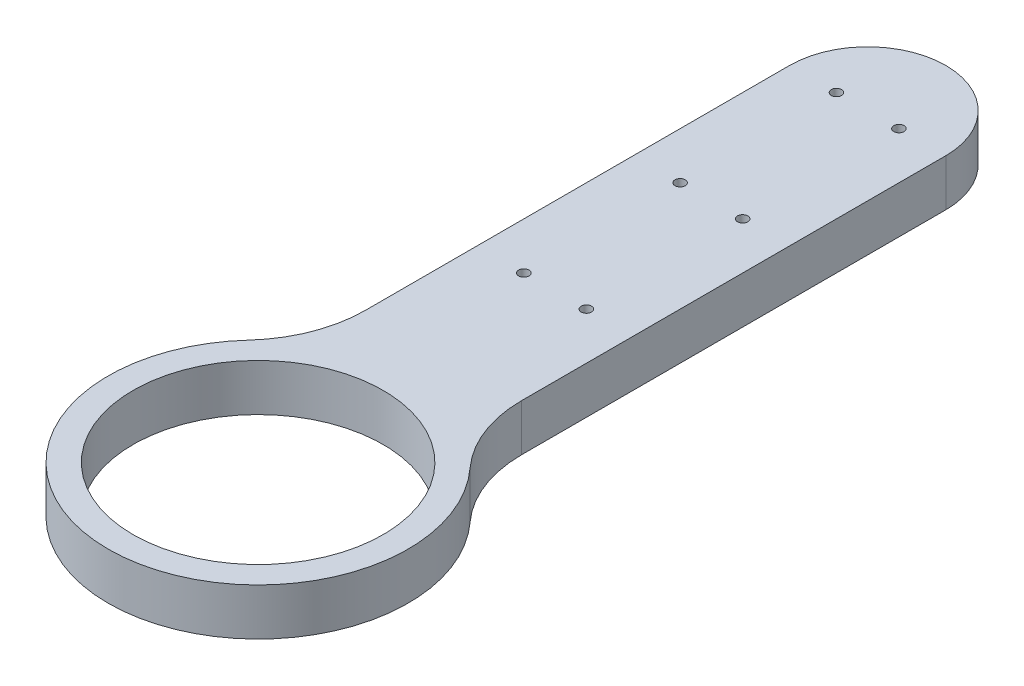
ISO-10303-21;
HEADER;
FILE_DESCRIPTION(('STEP AP214'),'2;1');
FILE_NAME('part.step','',(''),(''),'','','');
FILE_SCHEMA(('AUTOMOTIVE_DESIGN { 1 0 10303 214 1 1 1 1 }'));
ENDSEC;
DATA;
#1=APPLICATION_CONTEXT('core data for automotive mechanical design processes');
#2=APPLICATION_PROTOCOL_DEFINITION('international standard','automotive_design',2000,#1);
#3=PRODUCT_CONTEXT('',#1,'mechanical');
#4=PRODUCT('Part','Part','',(#3));
#5=PRODUCT_RELATED_PRODUCT_CATEGORY('part','',(#4));
#6=PRODUCT_DEFINITION_FORMATION('','',#4);
#7=PRODUCT_DEFINITION_CONTEXT('part definition',#1,'design');
#8=PRODUCT_DEFINITION('design','',#6,#7);
#9=PRODUCT_DEFINITION_SHAPE('','',#8);
#10=(LENGTH_UNIT() NAMED_UNIT(*) SI_UNIT(.MILLI.,.METRE.));
#11=(NAMED_UNIT(*) PLANE_ANGLE_UNIT() SI_UNIT($,.RADIAN.));
#12=(NAMED_UNIT(*) SI_UNIT($,.STERADIAN.) SOLID_ANGLE_UNIT());
#13=UNCERTAINTY_MEASURE_WITH_UNIT(LENGTH_MEASURE(1.E-05),#10,'distance_accuracy_value','');
#14=(GEOMETRIC_REPRESENTATION_CONTEXT(3) GLOBAL_UNCERTAINTY_ASSIGNED_CONTEXT((#13)) GLOBAL_UNIT_ASSIGNED_CONTEXT((#10,
#11,#12)) REPRESENTATION_CONTEXT('',''));
#15=CARTESIAN_POINT('',(0.,0.,0.));
#16=DIRECTION('',(0.,0.,1.));
#17=DIRECTION('',(1.,0.,0.));
#18=AXIS2_PLACEMENT_3D('',#15,#16,#17);
#19=CARTESIAN_POINT('',(0.,15.,-195.));
#20=DIRECTION('',(0.,-1.,0.));
#21=DIRECTION('',(0.,0.,-1.));
#22=AXIS2_PLACEMENT_3D('',#19,#20,#21);
#23=PLANE('',#22);
#24=CARTESIAN_POINT('',(10.,15.,-195.));
#25=DIRECTION('',(0.,-1.,0.));
#26=DIRECTION('',(0.,0.,-1.));
#27=AXIS2_PLACEMENT_3D('',#24,#25,#26);
#28=CIRCLE('',#27,1.65);
#29=CARTESIAN_POINT('',(10.,15.,-196.65));
#30=VERTEX_POINT('',#29);
#31=EDGE_CURVE('E234',#30,#30,#28,.T.);
#32=ORIENTED_EDGE('',*,*,#31,.T.);
#33=EDGE_LOOP('',(#32));
#34=FACE_BOUND('',#33,.T.);
#35=CARTESIAN_POINT('',(-10.,15.,-145.));
#36=DIRECTION('',(0.,-1.,0.));
#37=DIRECTION('',(0.,0.,-1.));
#38=AXIS2_PLACEMENT_3D('',#35,#36,#37);
#39=CIRCLE('',#38,1.65);
#40=CARTESIAN_POINT('',(-10.,15.,-146.65));
#41=VERTEX_POINT('',#40);
#42=EDGE_CURVE('E225',#41,#41,#39,.T.);
#43=ORIENTED_EDGE('',*,*,#42,.T.);
#44=EDGE_LOOP('',(#43));
#45=FACE_BOUND('',#44,.T.);
#46=CARTESIAN_POINT('',(10.,15.,-145.));
#47=DIRECTION('',(0.,-1.,0.));
#48=DIRECTION('',(0.,0.,-1.));
#49=AXIS2_PLACEMENT_3D('',#46,#47,#48);
#50=CIRCLE('',#49,1.65);
#51=CARTESIAN_POINT('',(10.,15.,-146.65));
#52=VERTEX_POINT('',#51);
#53=EDGE_CURVE('E249',#52,#52,#50,.T.);
#54=ORIENTED_EDGE('',*,*,#53,.T.);
#55=EDGE_LOOP('',(#54));
#56=FACE_BOUND('',#55,.T.);
#57=CARTESIAN_POINT('',(-10.,15.,-95.0000000000003));
#58=DIRECTION('',(0.,-1.,0.));
#59=DIRECTION('',(0.,0.,-1.));
#60=AXIS2_PLACEMENT_3D('',#57,#58,#59);
#61=CIRCLE('',#60,1.65);
#62=CARTESIAN_POINT('',(-10.,15.,-96.6500000000003));
#63=VERTEX_POINT('',#62);
#64=EDGE_CURVE('E240',#63,#63,#61,.T.);
#65=ORIENTED_EDGE('',*,*,#64,.T.);
#66=EDGE_LOOP('',(#65));
#67=FACE_BOUND('',#66,.T.);
#68=CARTESIAN_POINT('',(-10.,15.,-195.));
#69=DIRECTION('',(0.,-1.,0.));
#70=DIRECTION('',(0.,0.,-1.));
#71=AXIS2_PLACEMENT_3D('',#68,#69,#70);
#72=CIRCLE('',#71,1.65);
#73=CARTESIAN_POINT('',(-10.,15.,-196.65));
#74=VERTEX_POINT('',#73);
#75=EDGE_CURVE('E214',#74,#74,#72,.T.);
#76=ORIENTED_EDGE('',*,*,#75,.T.);
#77=EDGE_LOOP('',(#76));
#78=FACE_BOUND('',#77,.T.);
#79=CARTESIAN_POINT('',(10.,15.,-95.0000000000003));
#80=DIRECTION('',(0.,-1.,0.));
#81=DIRECTION('',(0.,0.,-1.));
#82=AXIS2_PLACEMENT_3D('',#79,#80,#81);
#83=CIRCLE('',#82,1.65);
#84=CARTESIAN_POINT('',(10.,15.,-96.6500000000003));
#85=VERTEX_POINT('',#84);
#86=EDGE_CURVE('E256',#85,#85,#83,.T.);
#87=ORIENTED_EDGE('',*,*,#86,.T.);
#88=EDGE_LOOP('',(#87));
#89=FACE_BOUND('',#88,.T.);
#90=CARTESIAN_POINT('',(0.,15.,-195.));
#91=DIRECTION('',(0.,1.,0.));
#92=DIRECTION('',(0.,0.,-1.));
#93=AXIS2_PLACEMENT_3D('',#90,#91,#92);
#94=CIRCLE('',#93,25.);
#95=CARTESIAN_POINT('',(25.,15.,-195.));
#96=VERTEX_POINT('',#95);
#97=CARTESIAN_POINT('',(-25.,15.,-195.));
#98=VERTEX_POINT('',#97);
#99=EDGE_CURVE('E146',#96,#98,#94,.T.);
#100=ORIENTED_EDGE('',*,*,#99,.T.);
#101=DIRECTION('',(0.,0.,1.));
#102=VECTOR('',#101,1.);
#103=CARTESIAN_POINT('',(-25.,15.,-59.311516944435));
#104=LINE('',#103,#102);
#105=CARTESIAN_POINT('',(-25.,15.,-59.311516944435));
#106=VERTEX_POINT('',#105);
#107=EDGE_CURVE('E94',#98,#106,#104,.T.);
#108=ORIENTED_EDGE('',*,*,#107,.T.);
#109=CARTESIAN_POINT('',(-65.,15.,-59.311516944435));
#110=DIRECTION('',(0.,-1.,0.));
#111=DIRECTION('',(0.,0.,-1.));
#112=AXIS2_PLACEMENT_3D('',#109,#110,#111);
#113=CIRCLE('',#112,40.);
#114=CARTESIAN_POINT('',(-35.4523629586276,15.,-32.3497450206293));
#115=VERTEX_POINT('',#114);
#116=EDGE_CURVE('E107',#106,#115,#113,.T.);
#117=ORIENTED_EDGE('',*,*,#116,.T.);
#118=CARTESIAN_POINT('',(0.,15.,0.));
#119=DIRECTION('',(0.,1.,0.));
#120=DIRECTION('',(0.,0.,1.));
#121=AXIS2_PLACEMENT_3D('',#118,#119,#120);
#122=CIRCLE('',#121,47.9935);
#123=CARTESIAN_POINT('',(35.4523629586276,15.,-32.3497450206293));
#124=VERTEX_POINT('',#123);
#125=EDGE_CURVE('E101',#115,#124,#122,.T.);
#126=ORIENTED_EDGE('',*,*,#125,.T.);
#127=CARTESIAN_POINT('',(65.,15.,-59.311516944435));
#128=DIRECTION('',(0.,-1.,0.));
#129=DIRECTION('',(0.,0.,-1.));
#130=AXIS2_PLACEMENT_3D('',#127,#128,#129);
#131=CIRCLE('',#130,40.);
#132=CARTESIAN_POINT('',(25.,15.,-59.311516944435));
#133=VERTEX_POINT('',#132);
#134=EDGE_CURVE('E105',#124,#133,#131,.T.);
#135=ORIENTED_EDGE('',*,*,#134,.T.);
#136=DIRECTION('',(0.,0.,-1.));
#137=VECTOR('',#136,1.);
#138=CARTESIAN_POINT('',(25.,15.,-59.311516944435));
#139=LINE('',#138,#137);
#140=EDGE_CURVE('E57',#133,#96,#139,.T.);
#141=ORIENTED_EDGE('',*,*,#140,.T.);
#142=EDGE_LOOP('',(#100,#108,#117,#126,#135,#141));
#143=FACE_BOUND('',#142,.T.);
#144=CARTESIAN_POINT('',(0.,15.,0.));
#145=DIRECTION('',(0.,1.,0.));
#146=DIRECTION('',(0.,0.,1.));
#147=AXIS2_PLACEMENT_3D('',#144,#145,#146);
#148=CIRCLE('',#147,39.9935);
#149=CARTESIAN_POINT('',(0.,15.,39.9935));
#150=VERTEX_POINT('',#149);
#151=EDGE_CURVE('E134',#150,#150,#148,.T.);
#152=ORIENTED_EDGE('',*,*,#151,.F.);
#153=EDGE_LOOP('',(#152));
#154=FACE_BOUND('',#153,.T.);
#155=ADVANCED_FACE('F39',(#34,#45,#56,#67,#78,#89,#143,#154),#23,.F.);
#156=CARTESIAN_POINT('',(0.,0.,-195.));
#157=DIRECTION('',(0.,-1.,0.));
#158=DIRECTION('',(0.,0.,-1.));
#159=AXIS2_PLACEMENT_3D('',#156,#157,#158);
#160=PLANE('',#159);
#161=CARTESIAN_POINT('',(10.,0.,-195.));
#162=DIRECTION('',(0.,-1.,0.));
#163=DIRECTION('',(0.,0.,-1.));
#164=AXIS2_PLACEMENT_3D('',#161,#162,#163);
#165=CIRCLE('',#164,1.65);
#166=CARTESIAN_POINT('',(10.,0.,-196.65));
#167=VERTEX_POINT('',#166);
#168=EDGE_CURVE('E222',#167,#167,#165,.T.);
#169=ORIENTED_EDGE('',*,*,#168,.F.);
#170=EDGE_LOOP('',(#169));
#171=FACE_BOUND('',#170,.T.);
#172=CARTESIAN_POINT('',(-10.,0.,-145.));
#173=DIRECTION('',(0.,-1.,0.));
#174=DIRECTION('',(0.,0.,-1.));
#175=AXIS2_PLACEMENT_3D('',#172,#173,#174);
#176=CIRCLE('',#175,1.65);
#177=CARTESIAN_POINT('',(-10.,0.,-146.65));
#178=VERTEX_POINT('',#177);
#179=EDGE_CURVE('E230',#178,#178,#176,.T.);
#180=ORIENTED_EDGE('',*,*,#179,.F.);
#181=EDGE_LOOP('',(#180));
#182=FACE_BOUND('',#181,.T.);
#183=CARTESIAN_POINT('',(10.,0.,-145.));
#184=DIRECTION('',(0.,-1.,0.));
#185=DIRECTION('',(0.,0.,-1.));
#186=AXIS2_PLACEMENT_3D('',#183,#184,#185);
#187=CIRCLE('',#186,1.65);
#188=CARTESIAN_POINT('',(10.,0.,-146.65));
#189=VERTEX_POINT('',#188);
#190=EDGE_CURVE('E229',#189,#189,#187,.T.);
#191=ORIENTED_EDGE('',*,*,#190,.F.);
#192=EDGE_LOOP('',(#191));
#193=FACE_BOUND('',#192,.T.);
#194=CARTESIAN_POINT('',(-10.,0.,-95.0000000000003));
#195=DIRECTION('',(0.,-1.,0.));
#196=DIRECTION('',(0.,0.,-1.));
#197=AXIS2_PLACEMENT_3D('',#194,#195,#196);
#198=CIRCLE('',#197,1.65);
#199=CARTESIAN_POINT('',(-10.,0.,-96.6500000000003));
#200=VERTEX_POINT('',#199);
#201=EDGE_CURVE('E245',#200,#200,#198,.T.);
#202=ORIENTED_EDGE('',*,*,#201,.F.);
#203=EDGE_LOOP('',(#202));
#204=FACE_BOUND('',#203,.T.);
#205=CARTESIAN_POINT('',(-10.,0.,-195.));
#206=DIRECTION('',(0.,-1.,0.));
#207=DIRECTION('',(0.,0.,-1.));
#208=AXIS2_PLACEMENT_3D('',#205,#206,#207);
#209=CIRCLE('',#208,1.65);
#210=CARTESIAN_POINT('',(-10.,0.,-196.65));
#211=VERTEX_POINT('',#210);
#212=EDGE_CURVE('E217',#211,#211,#209,.T.);
#213=ORIENTED_EDGE('',*,*,#212,.F.);
#214=EDGE_LOOP('',(#213));
#215=FACE_BOUND('',#214,.T.);
#216=CARTESIAN_POINT('',(10.,0.,-95.0000000000003));
#217=DIRECTION('',(0.,-1.,0.));
#218=DIRECTION('',(0.,0.,-1.));
#219=AXIS2_PLACEMENT_3D('',#216,#217,#218);
#220=CIRCLE('',#219,1.65);
#221=CARTESIAN_POINT('',(10.,0.,-96.6500000000003));
#222=VERTEX_POINT('',#221);
#223=EDGE_CURVE('E244',#222,#222,#220,.T.);
#224=ORIENTED_EDGE('',*,*,#223,.F.);
#225=EDGE_LOOP('',(#224));
#226=FACE_BOUND('',#225,.T.);
#227=CARTESIAN_POINT('',(0.,0.,-195.));
#228=DIRECTION('',(0.,1.,0.));
#229=DIRECTION('',(0.,0.,-1.));
#230=AXIS2_PLACEMENT_3D('',#227,#228,#229);
#231=CIRCLE('',#230,25.);
#232=CARTESIAN_POINT('',(25.,0.,-195.));
#233=VERTEX_POINT('',#232);
#234=CARTESIAN_POINT('',(-25.,0.,-195.));
#235=VERTEX_POINT('',#234);
#236=EDGE_CURVE('E129',#233,#235,#231,.T.);
#237=ORIENTED_EDGE('',*,*,#236,.F.);
#238=DIRECTION('',(0.,0.,-1.));
#239=VECTOR('',#238,1.);
#240=CARTESIAN_POINT('',(25.,0.,-59.311516944435));
#241=LINE('',#240,#239);
#242=CARTESIAN_POINT('',(25.,0.,-59.311516944435));
#243=VERTEX_POINT('',#242);
#244=EDGE_CURVE('E86',#243,#233,#241,.T.);
#245=ORIENTED_EDGE('',*,*,#244,.F.);
#246=CARTESIAN_POINT('',(65.,0.,-59.311516944435));
#247=DIRECTION('',(0.,-1.,0.));
#248=DIRECTION('',(0.,0.,-1.));
#249=AXIS2_PLACEMENT_3D('',#246,#247,#248);
#250=CIRCLE('',#249,40.);
#251=CARTESIAN_POINT('',(35.4523629586276,0.,-32.3497450206293));
#252=VERTEX_POINT('',#251);
#253=EDGE_CURVE('E80',#252,#243,#250,.T.);
#254=ORIENTED_EDGE('',*,*,#253,.F.);
#255=CARTESIAN_POINT('',(0.,0.,0.));
#256=DIRECTION('',(0.,1.,0.));
#257=DIRECTION('',(0.,0.,1.));
#258=AXIS2_PLACEMENT_3D('',#255,#256,#257);
#259=CIRCLE('',#258,47.9935);
#260=CARTESIAN_POINT('',(-35.4523629586276,0.,-32.3497450206293));
#261=VERTEX_POINT('',#260);
#262=EDGE_CURVE('E116',#261,#252,#259,.T.);
#263=ORIENTED_EDGE('',*,*,#262,.F.);
#264=CARTESIAN_POINT('',(-65.,0.,-59.311516944435));
#265=DIRECTION('',(0.,-1.,0.));
#266=DIRECTION('',(0.,0.,-1.));
#267=AXIS2_PLACEMENT_3D('',#264,#265,#266);
#268=CIRCLE('',#267,40.);
#269=CARTESIAN_POINT('',(-25.,0.,-59.311516944435));
#270=VERTEX_POINT('',#269);
#271=EDGE_CURVE('E137',#270,#261,#268,.T.);
#272=ORIENTED_EDGE('',*,*,#271,.F.);
#273=DIRECTION('',(0.,0.,1.));
#274=VECTOR('',#273,1.);
#275=CARTESIAN_POINT('',(-25.,0.,-59.311516944435));
#276=LINE('',#275,#274);
#277=EDGE_CURVE('E133',#235,#270,#276,.T.);
#278=ORIENTED_EDGE('',*,*,#277,.F.);
#279=EDGE_LOOP('',(#237,#245,#254,#263,#272,#278));
#280=FACE_BOUND('',#279,.T.);
#281=CARTESIAN_POINT('',(0.,0.,0.));
#282=DIRECTION('',(0.,1.,0.));
#283=DIRECTION('',(0.,0.,1.));
#284=AXIS2_PLACEMENT_3D('',#281,#282,#283);
#285=CIRCLE('',#284,39.9935);
#286=CARTESIAN_POINT('',(0.,0.,39.9935));
#287=VERTEX_POINT('',#286);
#288=EDGE_CURVE('E260',#287,#287,#285,.T.);
#289=ORIENTED_EDGE('',*,*,#288,.T.);
#290=EDGE_LOOP('',(#289));
#291=FACE_BOUND('',#290,.T.);
#292=ADVANCED_FACE('F159',(#171,#182,#193,#204,#215,#226,#280,#291),#160,.T.);
#293=CARTESIAN_POINT('',(0.,15.,-195.));
#294=DIRECTION('',(0.,-1.,0.));
#295=DIRECTION('',(0.,0.,-1.));
#296=AXIS2_PLACEMENT_3D('',#293,#294,#295);
#297=CYLINDRICAL_SURFACE('',#296,25.);
#298=ORIENTED_EDGE('',*,*,#236,.T.);
#299=DIRECTION('',(0.,-1.,0.));
#300=VECTOR('',#299,1.);
#301=CARTESIAN_POINT('',(-25.,15.,-195.));
#302=LINE('',#301,#300);
#303=EDGE_CURVE('E11',#98,#235,#302,.T.);
#304=ORIENTED_EDGE('',*,*,#303,.F.);
#305=ORIENTED_EDGE('',*,*,#99,.F.);
#306=DIRECTION('',(0.,-1.,0.));
#307=VECTOR('',#306,1.);
#308=CARTESIAN_POINT('',(25.,15.,-195.));
#309=LINE('',#308,#307);
#310=EDGE_CURVE('E125',#96,#233,#309,.T.);
#311=ORIENTED_EDGE('',*,*,#310,.T.);
#312=EDGE_LOOP('',(#298,#304,#305,#311));
#313=FACE_BOUND('',#312,.T.);
#314=ADVANCED_FACE('F41',(#313),#297,.T.);
#315=CARTESIAN_POINT('',(-25.,15.,-59.311516944435));
#316=DIRECTION('',(1.,0.,0.));
#317=DIRECTION('',(0.,0.,-1.));
#318=AXIS2_PLACEMENT_3D('',#315,#316,#317);
#319=PLANE('',#318);
#320=ORIENTED_EDGE('',*,*,#277,.T.);
#321=DIRECTION('',(0.,-1.,0.));
#322=VECTOR('',#321,1.);
#323=CARTESIAN_POINT('',(-25.,15.,-59.311516944435));
#324=LINE('',#323,#322);
#325=EDGE_CURVE('E49',#106,#270,#324,.T.);
#326=ORIENTED_EDGE('',*,*,#325,.F.);
#327=ORIENTED_EDGE('',*,*,#107,.F.);
#328=ORIENTED_EDGE('',*,*,#303,.T.);
#329=EDGE_LOOP('',(#320,#326,#327,#328));
#330=FACE_BOUND('',#329,.T.);
#331=ADVANCED_FACE('F362',(#330),#319,.F.);
#332=CARTESIAN_POINT('',(-65.,15.,-59.311516944435));
#333=DIRECTION('',(0.,-1.,0.));
#334=DIRECTION('',(0.,0.,-1.));
#335=AXIS2_PLACEMENT_3D('',#332,#333,#334);
#336=CYLINDRICAL_SURFACE('',#335,40.);
#337=ORIENTED_EDGE('',*,*,#271,.T.);
#338=DIRECTION('',(0.,-1.,0.));
#339=VECTOR('',#338,1.);
#340=CARTESIAN_POINT('',(-35.4523629586276,15.,-32.3497450206293));
#341=LINE('',#340,#339);
#342=EDGE_CURVE('E118',#115,#261,#341,.T.);
#343=ORIENTED_EDGE('',*,*,#342,.F.);
#344=ORIENTED_EDGE('',*,*,#116,.F.);
#345=ORIENTED_EDGE('',*,*,#325,.T.);
#346=EDGE_LOOP('',(#337,#343,#344,#345));
#347=FACE_BOUND('',#346,.T.);
#348=ADVANCED_FACE('F156',(#347),#336,.F.);
#349=CARTESIAN_POINT('',(0.,15.,0.));
#350=DIRECTION('',(0.,-1.,0.));
#351=DIRECTION('',(0.,0.,-1.));
#352=AXIS2_PLACEMENT_3D('',#349,#350,#351);
#353=CYLINDRICAL_SURFACE('',#352,47.9935);
#354=ORIENTED_EDGE('',*,*,#262,.T.);
#355=DIRECTION('',(0.,-1.,0.));
#356=VECTOR('',#355,1.);
#357=CARTESIAN_POINT('',(35.4523629586276,15.,-32.3497450206293));
#358=LINE('',#357,#356);
#359=EDGE_CURVE('E113',#124,#252,#358,.T.);
#360=ORIENTED_EDGE('',*,*,#359,.F.);
#361=ORIENTED_EDGE('',*,*,#125,.F.);
#362=ORIENTED_EDGE('',*,*,#342,.T.);
#363=EDGE_LOOP('',(#354,#360,#361,#362));
#364=FACE_BOUND('',#363,.T.);
#365=ADVANCED_FACE('F114',(#364),#353,.T.);
#366=CARTESIAN_POINT('',(65.,15.,-59.311516944435));
#367=DIRECTION('',(0.,-1.,0.));
#368=DIRECTION('',(0.,0.,-1.));
#369=AXIS2_PLACEMENT_3D('',#366,#367,#368);
#370=CYLINDRICAL_SURFACE('',#369,40.);
#371=ORIENTED_EDGE('',*,*,#253,.T.);
#372=DIRECTION('',(0.,-1.,0.));
#373=VECTOR('',#372,1.);
#374=CARTESIAN_POINT('',(25.,15.,-59.311516944435));
#375=LINE('',#374,#373);
#376=EDGE_CURVE('E119',#133,#243,#375,.T.);
#377=ORIENTED_EDGE('',*,*,#376,.F.);
#378=ORIENTED_EDGE('',*,*,#134,.F.);
#379=ORIENTED_EDGE('',*,*,#359,.T.);
#380=EDGE_LOOP('',(#371,#377,#378,#379));
#381=FACE_BOUND('',#380,.T.);
#382=ADVANCED_FACE('F121',(#381),#370,.F.);
#383=CARTESIAN_POINT('',(25.,15.,-59.311516944435));
#384=DIRECTION('',(-1.,0.,0.));
#385=DIRECTION('',(0.,0.,1.));
#386=AXIS2_PLACEMENT_3D('',#383,#384,#385);
#387=PLANE('',#386);
#388=ORIENTED_EDGE('',*,*,#244,.T.);
#389=ORIENTED_EDGE('',*,*,#310,.F.);
#390=ORIENTED_EDGE('',*,*,#140,.F.);
#391=ORIENTED_EDGE('',*,*,#376,.T.);
#392=EDGE_LOOP('',(#388,#389,#390,#391));
#393=FACE_BOUND('',#392,.T.);
#394=ADVANCED_FACE('F164',(#393),#387,.F.);
#395=CARTESIAN_POINT('',(0.,15.,0.));
#396=DIRECTION('',(0.,-1.,0.));
#397=DIRECTION('',(0.,0.,-1.));
#398=AXIS2_PLACEMENT_3D('',#395,#396,#397);
#399=CYLINDRICAL_SURFACE('',#398,39.9935);
#400=ORIENTED_EDGE('',*,*,#151,.T.);
#401=EDGE_LOOP('',(#400));
#402=FACE_BOUND('',#401,.T.);
#403=ORIENTED_EDGE('',*,*,#288,.F.);
#404=EDGE_LOOP('',(#403));
#405=FACE_BOUND('',#404,.T.);
#406=ADVANCED_FACE('F166',(#402,#405),#399,.F.);
#407=CARTESIAN_POINT('',(10.,15.,-95.0000000000003));
#408=DIRECTION('',(0.,-1.,0.));
#409=DIRECTION('',(0.,0.,-1.));
#410=AXIS2_PLACEMENT_3D('',#407,#408,#409);
#411=CYLINDRICAL_SURFACE('',#410,1.65);
#412=ORIENTED_EDGE('',*,*,#86,.F.);
#413=EDGE_LOOP('',(#412));
#414=FACE_BOUND('',#413,.T.);
#415=ORIENTED_EDGE('',*,*,#223,.T.);
#416=EDGE_LOOP('',(#415));
#417=FACE_BOUND('',#416,.T.);
#418=ADVANCED_FACE('F172',(#414,#417),#411,.F.);
#419=CARTESIAN_POINT('',(-10.,15.,-195.));
#420=DIRECTION('',(0.,-1.,0.));
#421=DIRECTION('',(0.,0.,-1.));
#422=AXIS2_PLACEMENT_3D('',#419,#420,#421);
#423=CYLINDRICAL_SURFACE('',#422,1.65);
#424=ORIENTED_EDGE('',*,*,#75,.F.);
#425=EDGE_LOOP('',(#424));
#426=FACE_BOUND('',#425,.T.);
#427=ORIENTED_EDGE('',*,*,#212,.T.);
#428=EDGE_LOOP('',(#427));
#429=FACE_BOUND('',#428,.T.);
#430=ADVANCED_FACE('F189',(#426,#429),#423,.F.);
#431=CARTESIAN_POINT('',(-10.,15.,-95.0000000000003));
#432=DIRECTION('',(0.,-1.,0.));
#433=DIRECTION('',(0.,0.,-1.));
#434=AXIS2_PLACEMENT_3D('',#431,#432,#433);
#435=CYLINDRICAL_SURFACE('',#434,1.65);
#436=ORIENTED_EDGE('',*,*,#64,.F.);
#437=EDGE_LOOP('',(#436));
#438=FACE_BOUND('',#437,.T.);
#439=ORIENTED_EDGE('',*,*,#201,.T.);
#440=EDGE_LOOP('',(#439));
#441=FACE_BOUND('',#440,.T.);
#442=ADVANCED_FACE('F195',(#438,#441),#435,.F.);
#443=CARTESIAN_POINT('',(10.,15.,-145.));
#444=DIRECTION('',(0.,-1.,0.));
#445=DIRECTION('',(0.,0.,-1.));
#446=AXIS2_PLACEMENT_3D('',#443,#444,#445);
#447=CYLINDRICAL_SURFACE('',#446,1.65);
#448=ORIENTED_EDGE('',*,*,#53,.F.);
#449=EDGE_LOOP('',(#448));
#450=FACE_BOUND('',#449,.T.);
#451=ORIENTED_EDGE('',*,*,#190,.T.);
#452=EDGE_LOOP('',(#451));
#453=FACE_BOUND('',#452,.T.);
#454=ADVANCED_FACE('F191',(#450,#453),#447,.F.);
#455=CARTESIAN_POINT('',(-10.,15.,-145.));
#456=DIRECTION('',(0.,-1.,0.));
#457=DIRECTION('',(0.,0.,-1.));
#458=AXIS2_PLACEMENT_3D('',#455,#456,#457);
#459=CYLINDRICAL_SURFACE('',#458,1.65);
#460=ORIENTED_EDGE('',*,*,#42,.F.);
#461=EDGE_LOOP('',(#460));
#462=FACE_BOUND('',#461,.T.);
#463=ORIENTED_EDGE('',*,*,#179,.T.);
#464=EDGE_LOOP('',(#463));
#465=FACE_BOUND('',#464,.T.);
#466=ADVANCED_FACE('F194',(#462,#465),#459,.F.);
#467=CARTESIAN_POINT('',(10.,15.,-195.));
#468=DIRECTION('',(0.,-1.,0.));
#469=DIRECTION('',(0.,0.,-1.));
#470=AXIS2_PLACEMENT_3D('',#467,#468,#469);
#471=CYLINDRICAL_SURFACE('',#470,1.65);
#472=ORIENTED_EDGE('',*,*,#31,.F.);
#473=EDGE_LOOP('',(#472));
#474=FACE_BOUND('',#473,.T.);
#475=ORIENTED_EDGE('',*,*,#168,.T.);
#476=EDGE_LOOP('',(#475));
#477=FACE_BOUND('',#476,.T.);
#478=ADVANCED_FACE('F200',(#474,#477),#471,.F.);
#479=CLOSED_SHELL('',(#155,#292,#314,#331,#348,#365,#382,#394,#406,#418,#430,#442,#454,#466,#478));
#480=MANIFOLD_SOLID_BREP('B2',#479);
#481=ADVANCED_BREP_SHAPE_REPRESENTATION('',(#18,#480),#14);
#482=SHAPE_DEFINITION_REPRESENTATION(#9,#481);
ENDSEC;
END-ISO-10303-21;
